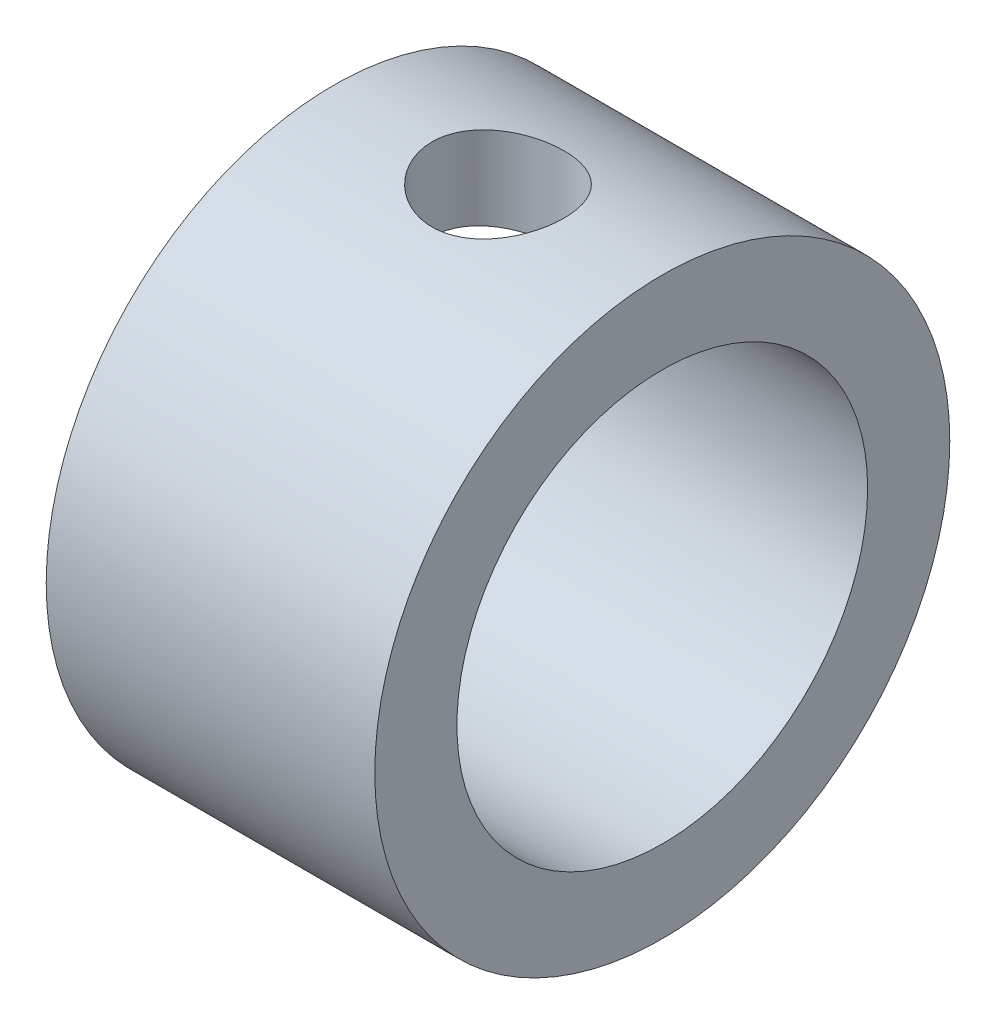
ISO-10303-21;
HEADER;
FILE_DESCRIPTION(('STEP AP214'),'2;1');
FILE_NAME('part.step','',(''),(''),'','','');
FILE_SCHEMA(('AUTOMOTIVE_DESIGN { 1 0 10303 214 1 1 1 1 }'));
ENDSEC;
DATA;
#1=APPLICATION_CONTEXT('core data for automotive mechanical design processes');
#2=APPLICATION_PROTOCOL_DEFINITION('international standard','automotive_design',2000,#1);
#3=PRODUCT_CONTEXT('',#1,'mechanical');
#4=PRODUCT('Part','Part','',(#3));
#5=PRODUCT_RELATED_PRODUCT_CATEGORY('part','',(#4));
#6=PRODUCT_DEFINITION_FORMATION('','',#4);
#7=PRODUCT_DEFINITION_CONTEXT('part definition',#1,'design');
#8=PRODUCT_DEFINITION('design','',#6,#7);
#9=PRODUCT_DEFINITION_SHAPE('','',#8);
#10=(LENGTH_UNIT() NAMED_UNIT(*) SI_UNIT(.MILLI.,.METRE.));
#11=(NAMED_UNIT(*) PLANE_ANGLE_UNIT() SI_UNIT($,.RADIAN.));
#12=(NAMED_UNIT(*) SI_UNIT($,.STERADIAN.) SOLID_ANGLE_UNIT());
#13=UNCERTAINTY_MEASURE_WITH_UNIT(LENGTH_MEASURE(1.E-05),#10,'distance_accuracy_value','');
#14=(GEOMETRIC_REPRESENTATION_CONTEXT(3) GLOBAL_UNCERTAINTY_ASSIGNED_CONTEXT((#13)) GLOBAL_UNIT_ASSIGNED_CONTEXT((#10,
#11,#12)) REPRESENTATION_CONTEXT('',''));
#15=CARTESIAN_POINT('',(0.,0.,0.));
#16=DIRECTION('',(0.,0.,1.));
#17=DIRECTION('',(1.,0.,0.));
#18=AXIS2_PLACEMENT_3D('',#15,#16,#17);
#19=CARTESIAN_POINT('',(6.35,0.,0.));
#20=DIRECTION('',(-1.,0.,0.));
#21=DIRECTION('',(0.,0.,1.));
#22=AXIS2_PLACEMENT_3D('',#19,#20,#21);
#23=CYLINDRICAL_SURFACE('',#22,11.1125);
#24=CARTESIAN_POINT('',(6.35,0.,0.));
#25=DIRECTION('',(1.,0.,0.));
#26=DIRECTION('',(0.,0.,-1.));
#27=AXIS2_PLACEMENT_3D('',#24,#25,#26);
#28=CIRCLE('',#27,11.1125);
#29=CARTESIAN_POINT('',(6.35,0.,-11.1125));
#30=VERTEX_POINT('',#29);
#31=EDGE_CURVE('E10',#30,#30,#28,.T.);
#32=ORIENTED_EDGE('',*,*,#31,.F.);
#33=EDGE_LOOP('',(#32));
#34=FACE_BOUND('',#33,.T.);
#35=CARTESIAN_POINT('',(-6.35,0.,0.));
#36=DIRECTION('',(1.,0.,0.));
#37=DIRECTION('',(0.,0.,-1.));
#38=AXIS2_PLACEMENT_3D('',#35,#36,#37);
#39=CIRCLE('',#38,11.1125);
#40=CARTESIAN_POINT('',(-6.35,0.,-11.1125));
#41=VERTEX_POINT('',#40);
#42=EDGE_CURVE('E59',#41,#41,#39,.T.);
#43=ORIENTED_EDGE('',*,*,#42,.T.);
#44=EDGE_LOOP('',(#43));
#45=FACE_BOUND('',#44,.T.);
#46=CARTESIAN_POINT('',(-2.5527,11.1125,0.));
#47=CARTESIAN_POINT('',(-2.55269543609178,11.1124974332018,0.141396983886955));
#48=CARTESIAN_POINT('',(-2.54091216211283,11.1097740216355,0.282847633119295));
#49=CARTESIAN_POINT('',(-2.494146592161,11.0991731061528,0.561718841900642));
#50=CARTESIAN_POINT('',(-2.45914887715804,11.0912921766601,0.69913665945262));
#51=CARTESIAN_POINT('',(-2.36711810464586,11.0712520995187,0.965872712295733));
#52=CARTESIAN_POINT('',(-2.31010924032117,11.0590976503434,1.09519965980491));
#53=CARTESIAN_POINT('',(-2.17575411001897,11.0318164511271,1.34245067648933));
#54=CARTESIAN_POINT('',(-2.09840795295294,11.0166897170037,1.46037480672501));
#55=CARTESIAN_POINT('',(-1.92413477586071,10.9848185181146,1.68355013345253));
#56=CARTESIAN_POINT('',(-1.82691809781612,10.968052296778,1.78857205214091));
#57=CARTESIAN_POINT('',(-1.61628478246275,10.934942063033,1.98097209612807));
#58=CARTESIAN_POINT('',(-1.50286658042958,10.9185980915853,2.06834851527531));
#59=CARTESIAN_POINT('',(-1.26132586117081,10.8879668420535,2.22401124092947));
#60=CARTESIAN_POINT('',(-1.13303951192519,10.8737073603938,2.29204929168297));
#61=CARTESIAN_POINT('',(-0.866471521299751,10.8491736694577,2.40551015870537));
#62=CARTESIAN_POINT('',(-0.728191211176467,10.8388989305457,2.45093598072595));
#63=CARTESIAN_POINT('',(-0.448059578140271,10.8237203833916,2.51711689808377));
#64=CARTESIAN_POINT('',(-0.306309588542869,10.8187278368241,2.53828011863612));
#65=CARTESIAN_POINT('',(-0.0211899516022485,10.8144127531456,2.55660488622197));
#66=CARTESIAN_POINT('',(0.122179472637741,10.8150894442946,2.5537697001011));
#67=CARTESIAN_POINT('',(0.403403115674324,10.821956227423,2.52450561772006));
#68=CARTESIAN_POINT('',(0.541310236477793,10.8280345796907,2.49855486877438));
#69=CARTESIAN_POINT('',(0.810759487185956,10.8448426730924,2.42455559340402));
#70=CARTESIAN_POINT('',(0.942301226672394,10.8555726991342,2.37650571343134));
#71=CARTESIAN_POINT('',(1.19660889805742,10.8805826828167,2.25924386489669));
#72=CARTESIAN_POINT('',(1.31928859238525,10.8948926919292,2.1898515486303));
#73=CARTESIAN_POINT('',(1.55143756353517,10.9254323400943,2.03200118441898));
#74=CARTESIAN_POINT('',(1.66090486145427,10.9416622659858,1.94354028596765));
#75=CARTESIAN_POINT('',(1.86627037617572,10.9746894913781,1.74755103037359));
#76=CARTESIAN_POINT('',(1.96178125752,10.9914910747966,1.6396170918003));
#77=CARTESIAN_POINT('',(2.13341345311464,11.023416046553,1.4090694191414));
#78=CARTESIAN_POINT('',(2.20953434232427,11.038539398099,1.28645536334506));
#79=CARTESIAN_POINT('',(2.34033690164464,11.0654612367422,1.02952843056193));
#80=CARTESIAN_POINT('',(2.39496373513032,11.0772511982725,0.895186685498861));
#81=CARTESIAN_POINT('',(2.48075726891652,11.0961150585293,0.618898468394044));
#82=CARTESIAN_POINT('',(2.51192774079699,11.1031897154151,0.47695322286274));
#83=CARTESIAN_POINT('',(2.54935090647034,11.1117164801432,0.192806062598151));
#84=CARTESIAN_POINT('',(2.55613213294177,11.113287828652,0.0506772392291482));
#85=CARTESIAN_POINT('',(2.54602262164829,11.1109669165554,-0.232682790362517));
#86=CARTESIAN_POINT('',(2.52913366434222,11.1070750668889,-0.373914063295773));
#87=CARTESIAN_POINT('',(2.47260072267747,11.0943407059216,-0.649689940724076));
#88=CARTESIAN_POINT('',(2.4332377128462,11.0855593569585,-0.784295220339056));
#89=CARTESIAN_POINT('',(2.33318895225672,11.0640306843712,-1.04499043452638));
#90=CARTESIAN_POINT('',(2.27250126147444,11.0512829999195,-1.17107959309543));
#91=CARTESIAN_POINT('',(2.1304507458463,11.0229440884721,-1.41332120124059));
#92=CARTESIAN_POINT('',(2.048782286807,11.0073118817893,-1.52928952317552));
#93=CARTESIAN_POINT('',(1.86748688971703,10.9750146582244,-1.74606464066494));
#94=CARTESIAN_POINT('',(1.76785736178379,10.9583494926232,-1.84686924584851));
#95=CARTESIAN_POINT('',(1.55103198206712,10.9254467634652,-2.03257541541658));
#96=CARTESIAN_POINT('',(1.43351831842948,10.9092249340049,-2.11710924087233));
#97=CARTESIAN_POINT('',(1.18565404716245,10.8794322006874,-2.26524689249241));
#98=CARTESIAN_POINT('',(1.05530400977803,10.86586117915,-2.32885164786836));
#99=CARTESIAN_POINT('',(0.786177613562212,10.8430441251685,-2.43287654255067));
#100=CARTESIAN_POINT('',(0.647455448603506,10.8337730723205,-2.4734311243702));
#101=CARTESIAN_POINT('',(0.364922269391302,10.8205665517312,-2.53058731275079));
#102=CARTESIAN_POINT('',(0.221112171428213,10.8166301282402,-2.54719320998149));
#103=CARTESIAN_POINT('',(-0.0637959487676096,10.8146031362269,-2.55578363505916));
#104=CARTESIAN_POINT('',(-0.204875667199246,10.8163737834957,-2.54835267393322));
#105=CARTESIAN_POINT('',(-0.483714090983084,10.8252451891123,-2.51039749828933));
#106=CARTESIAN_POINT('',(-0.621472844107363,10.8323458707403,-2.47987361616779));
#107=CARTESIAN_POINT('',(-0.889236839253046,10.8510062561454,-2.3968943427457));
#108=CARTESIAN_POINT('',(-1.01927243310839,10.8625469579085,-2.3445323331879));
#109=CARTESIAN_POINT('',(-1.26879687912242,10.8887927027367,-2.21944049580401));
#110=CARTESIAN_POINT('',(-1.38828450265125,10.9034981137437,-2.14670829936039));
#111=CARTESIAN_POINT('',(-1.61618375706103,10.9348245866065,-1.9810379612459));
#112=CARTESIAN_POINT('',(-1.72429041036667,10.9514809440837,-1.8876868833472));
#113=CARTESIAN_POINT('',(-1.92349533486788,10.9846047749399,-1.68425493001492));
#114=CARTESIAN_POINT('',(-2.01458964143335,11.0010722034529,-1.57417016570687));
#115=CARTESIAN_POINT('',(-2.17846924085506,11.0322493068355,-1.33845249094086));
#116=CARTESIAN_POINT('',(-2.25096706522613,11.0469297293786,-1.21261560861977));
#117=CARTESIAN_POINT('',(-2.37366577455705,11.0725807717166,-0.950225185766307));
#118=CARTESIAN_POINT('',(-2.4238844591734,11.0835543513714,-0.813680303281804));
#119=CARTESIAN_POINT('',(-2.49214622236147,11.0987087733419,-0.564265101296297));
#120=CARTESIAN_POINT('',(-2.51480868895532,11.1038473015745,-0.452694131517629));
#121=CARTESIAN_POINT('',(-2.5450870106318,11.1107438567368,-0.227426938195051));
#122=CARTESIAN_POINT('',(-2.55270367092034,11.1125020645708,-0.113730828710922));
#123=CARTESIAN_POINT('',(-2.5527,11.1125,0.));
#124=B_SPLINE_CURVE_WITH_KNOTS('',3,(#46,#47,#48,#49,#50,#51,#52,#53,#54,#55,#56,#57,#58,#59,
#60,#61,#62,#63,#64,#65,#66,#67,#68,#69,#70,#71,#72,#73,#74,#75,#76,#77,#78,#79,#80,#81,#82,#83,
#84,#85,#86,#87,#88,#89,#90,#91,#92,#93,#94,#95,#96,#97,#98,#99,#100,#101,#102,#103,#104,#105,
#106,#107,#108,#109,#110,#111,#112,#113,#114,#115,#116,#117,#118,#119,#120,#121,#122,#123),
.UNSPECIFIED.,.T.,.F.,(4,2,2,2,2,2,2,2,2,2,2,2,2,2,2,2,2,2,2,2,2,2,2,2,2,2,2,2,2,2,2,2,2,2,2,2,
2,2,4),(0.,0.423774493378563,0.847830739970781,1.2714222130667,1.69501141776644,
2.12528317574872,2.55559651700898,2.99120733527721,3.42676023409687,3.85487386840065,
4.28292922555791,4.70233068759837,5.12175784094858,5.54483141941707,5.96796828582672,
6.4012295003574,6.83450021142714,7.26886924458625,7.7031684200319,8.12799731890801,
8.55279426409172,8.97239311136646,9.39203014175463,9.81816596051273,10.2443632748178,
10.679284091649,11.1141855962021,11.5465237531631,11.9787844423722,12.4006134783276,
12.8224364426482,13.2424738545288,13.6625601280783,14.0919775032118,14.521494827071,
14.9572982433888,15.3927528498978,15.7336286063474,16.0744861196662),.UNSPECIFIED.);
#125=CARTESIAN_POINT('',(-2.5527,11.1125,0.));
#126=VERTEX_POINT('',#125);
#127=EDGE_CURVE('E71',#126,#126,#124,.T.);
#128=ORIENTED_EDGE('',*,*,#127,.F.);
#129=EDGE_LOOP('',(#128));
#130=FACE_BOUND('',#129,.T.);
#131=ADVANCED_FACE('F45',(#34,#45,#130),#23,.T.);
#132=CARTESIAN_POINT('',(6.35,0.,0.));
#133=DIRECTION('',(-1.,0.,0.));
#134=DIRECTION('',(0.,0.,1.));
#135=AXIS2_PLACEMENT_3D('',#132,#133,#134);
#136=CYLINDRICAL_SURFACE('',#135,7.9375);
#137=CARTESIAN_POINT('',(-6.35,0.,0.));
#138=DIRECTION('',(1.,0.,0.));
#139=DIRECTION('',(0.,0.,-1.));
#140=AXIS2_PLACEMENT_3D('',#137,#138,#139);
#141=CIRCLE('',#140,7.9375);
#142=CARTESIAN_POINT('',(-6.35,0.,-7.9375));
#143=VERTEX_POINT('',#142);
#144=EDGE_CURVE('E67',#143,#143,#141,.T.);
#145=ORIENTED_EDGE('',*,*,#144,.F.);
#146=EDGE_LOOP('',(#145));
#147=FACE_BOUND('',#146,.T.);
#148=CARTESIAN_POINT('',(6.35,0.,0.));
#149=DIRECTION('',(1.,0.,0.));
#150=DIRECTION('',(0.,0.,-1.));
#151=AXIS2_PLACEMENT_3D('',#148,#149,#150);
#152=CIRCLE('',#151,7.9375);
#153=CARTESIAN_POINT('',(6.35,0.,-7.9375));
#154=VERTEX_POINT('',#153);
#155=EDGE_CURVE('E65',#154,#154,#152,.T.);
#156=ORIENTED_EDGE('',*,*,#155,.T.);
#157=EDGE_LOOP('',(#156));
#158=FACE_BOUND('',#157,.T.);
#159=CARTESIAN_POINT('',(0.,7.51582523479624,-2.5527));
#160=CARTESIAN_POINT('',(-0.139346600684586,7.51582557632367,-2.55269971114753));
#161=CARTESIAN_POINT('',(-0.27869699952722,7.51974293711517,-2.54125136242513));
#162=CARTESIAN_POINT('',(-0.553289021729112,7.53491469994466,-2.49590144689574));
#163=CARTESIAN_POINT('',(-0.688529718161482,7.54617074452564,-2.46199485346112));
#164=CARTESIAN_POINT('',(-0.950883193784566,7.57461596048416,-2.37302681179356));
#165=CARTESIAN_POINT('',(-1.078010509473,7.59179414625879,-2.31800451206632));
#166=CARTESIAN_POINT('',(-1.32126769030459,7.63013252920181,-2.18849893119843));
#167=CARTESIAN_POINT('',(-1.43739539312875,7.65129350688081,-2.11401183441432));
#168=CARTESIAN_POINT('',(-1.65958353854979,7.69607697591265,-1.94478738917102));
#169=CARTESIAN_POINT('',(-1.76518494023195,7.71975767441604,-1.84946258910936));
#170=CARTESIAN_POINT('',(-1.95921258795073,7.76641850896737,-1.64252426841838));
#171=CARTESIAN_POINT('',(-2.04763628538701,7.78939854063389,-1.53090833502211));
#172=CARTESIAN_POINT('',(-2.20684863248756,7.83273811564113,-1.29123243811476));
#173=CARTESIAN_POINT('',(-2.27716100619694,7.85302117283388,-1.16284104461704));
#174=CARTESIAN_POINT('',(-2.39501233362205,7.8879991108473,-0.895290498759001));
#175=CARTESIAN_POINT('',(-2.44255697524526,7.90269538718606,-0.756134045861248));
#176=CARTESIAN_POINT('',(-2.51198024703793,7.92443176811295,-0.475812759716062));
#177=CARTESIAN_POINT('',(-2.53464422780791,7.93170559808778,-0.334860880829301));
#178=CARTESIAN_POINT('',(-2.55615493246242,7.93860479377837,-0.0509798569865123));
#179=CARTESIAN_POINT('',(-2.5550073809634,7.93823199784733,0.0919488044667008));
#180=CARTESIAN_POINT('',(-2.52943629368598,7.93004082009178,0.370185317384752));
#181=CARTESIAN_POINT('',(-2.50586481560465,7.92249500445732,0.505580796411313));
#182=CARTESIAN_POINT('',(-2.43751776230091,7.90114386763205,0.770380742636993));
#183=CARTESIAN_POINT('',(-2.39274077860332,7.88733813065823,0.899784811258246));
#184=CARTESIAN_POINT('',(-2.2827279989642,7.85466059751731,1.15085020327595));
#185=CARTESIAN_POINT('',(-2.21724060023923,7.83572693368372,1.27239289382776));
#186=CARTESIAN_POINT('',(-2.06787007169733,7.79477815468616,1.50302341639291));
#187=CARTESIAN_POINT('',(-1.98398208464017,7.77276222644681,1.61210794821745));
#188=CARTESIAN_POINT('',(-1.79585146804467,7.72683916797508,1.81980166153172));
#189=CARTESIAN_POINT('',(-1.69087554558153,7.70289144803447,1.91773859169293));
#190=CARTESIAN_POINT('',(-1.46577399287371,7.65663172667181,2.09482578186573));
#191=CARTESIAN_POINT('',(-1.34564635478873,7.63431994265775,2.17397354800429));
#192=CARTESIAN_POINT('',(-1.09165337170638,7.59364591537561,2.31208063987044));
#193=CARTESIAN_POINT('',(-0.957635538939519,7.57533633304698,2.37077620004262));
#194=CARTESIAN_POINT('',(-0.680884720988729,7.54535361303556,2.46454804263225));
#195=CARTESIAN_POINT('',(-0.538155111476081,7.53367792268044,2.49963341103546));
#196=CARTESIAN_POINT('',(-0.254504014560251,7.51885630848756,2.54386130196757));
#197=CARTESIAN_POINT('',(-0.113761607191343,7.51537033531058,2.55403882928714));
#198=CARTESIAN_POINT('',(0.167434668389009,7.51637595825513,2.55107903074837));
#199=CARTESIAN_POINT('',(0.307888580594817,7.52086623101547,2.53794557248091));
#200=CARTESIAN_POINT('',(0.579957850714505,7.53698124897552,2.48966382858495));
#201=CARTESIAN_POINT('',(0.711712248409019,7.54837899305516,2.4552152966626));
#202=CARTESIAN_POINT('',(0.967551252350036,7.5767802378559,2.36611058505873));
#203=CARTESIAN_POINT('',(1.09163455564805,7.59378468779607,2.31145098343907));
#204=CARTESIAN_POINT('',(1.3327328212018,7.6321162522493,2.1816068300828));
#205=CARTESIAN_POINT('',(1.44942388192024,7.65355778281115,2.10585551398745));
#206=CARTESIAN_POINT('',(1.66881407590932,7.69811716781962,1.93663149325976));
#207=CARTESIAN_POINT('',(1.77150934883917,7.72123548207621,1.8431539162752));
#208=CARTESIAN_POINT('',(1.96468756476134,7.76778209364926,1.63621078826372));
#209=CARTESIAN_POINT('',(2.05442840868062,7.79117879009399,1.52204346361738));
#210=CARTESIAN_POINT('',(2.21351548432416,7.83462873838242,1.27969958075879));
#211=CARTESIAN_POINT('',(2.28286257154473,7.85468213045889,1.15152361050373));
#212=CARTESIAN_POINT('',(2.39853808556114,7.88907942673089,0.885532654196055));
#213=CARTESIAN_POINT('',(2.445027112656,7.90346302077295,0.747792911769806));
#214=CARTESIAN_POINT('',(2.51401054606968,7.9250735620805,0.465901724515));
#215=CARTESIAN_POINT('',(2.53651295201225,7.93230289525989,0.321752434011375));
#216=CARTESIAN_POINT('',(2.55620404018551,7.93862276867031,0.0379460330004133));
#217=CARTESIAN_POINT('',(2.55446170242952,7.93805701493034,-0.101630102083227));
#218=CARTESIAN_POINT('',(2.52832011934629,7.92968343190555,-0.378409596964345));
#219=CARTESIAN_POINT('',(2.50392250248309,7.92187612314457,-0.515613126582933));
#220=CARTESIAN_POINT('',(2.43385651640187,7.90001304735228,-0.781865580300782));
#221=CARTESIAN_POINT('',(2.38848882677044,7.88604573137923,-0.911001404067889));
#222=CARTESIAN_POINT('',(2.27804477503025,7.85330151374033,-1.15988567794138));
#223=CARTESIAN_POINT('',(2.21296494366969,7.83452376554898,-1.27963247094506));
#224=CARTESIAN_POINT('',(2.06229427825578,7.79328323599368,-1.51093927736791));
#225=CARTESIAN_POINT('',(1.9760609395036,7.77071383671048,-1.62206154036841));
#226=CARTESIAN_POINT('',(1.78664678677468,7.72472049993587,-1.82861081906446));
#227=CARTESIAN_POINT('',(1.68346075731545,7.70129630119661,-1.9240329864988));
#228=CARTESIAN_POINT('',(1.45866103703046,7.65524731576655,-2.09992084227194));
#229=CARTESIAN_POINT('',(1.33652113332413,7.632680889579,-2.17973125519224));
#230=CARTESIAN_POINT('',(1.07987227668964,7.59195286462518,-2.31761819300013));
#231=CARTESIAN_POINT('',(0.945367606277684,7.57378974864802,-2.37570220772249));
#232=CARTESIAN_POINT('',(0.677198370924444,7.54517670691244,-2.46500929147571));
#233=CARTESIAN_POINT('',(0.544100171379159,7.53428580739224,-2.49779199911675));
#234=CARTESIAN_POINT('',(0.274001787540594,7.51961091874832,-2.54163439196638));
#235=CARTESIAN_POINT('',(0.137002729499932,7.51582489901346,-2.55270028399384));
#236=CARTESIAN_POINT('',(0.,7.51582523479624,-2.5527));
#237=B_SPLINE_CURVE_WITH_KNOTS('',3,(#159,#160,#161,#162,#163,#164,#165,#166,#167,#168,#169,
#170,#171,#172,#173,#174,#175,#176,#177,#178,#179,#180,#181,#182,#183,#184,#185,#186,#187,#188,
#189,#190,#191,#192,#193,#194,#195,#196,#197,#198,#199,#200,#201,#202,#203,#204,#205,#206,#207,
#208,#209,#210,#211,#212,#213,#214,#215,#216,#217,#218,#219,#220,#221,#222,#223,#224,#225,#226,
#227,#228,#229,#230,#231,#232,#233,#234,#235,#236),.UNSPECIFIED.,.T.,.F.,(4,2,2,2,2,2,2,2,2,2,2,
2,2,2,2,2,2,2,2,2,2,2,2,2,2,2,2,2,2,2,2,2,2,2,2,2,2,2,4),(0.,0.41753318231001,0.83515984892337,
1.2520159476343,1.66895382315362,2.09965907144686,2.5304281733604,2.9715771175109,
3.41261579485476,3.83929288712334,4.26586740160019,4.67685449886291,5.0878688978247,
5.50408186614504,5.92040483554259,6.35504909017835,6.789751002637,7.22986792330262,
7.66981537535615,8.09114538435516,8.512405495847,8.92052032785668,9.32870428949052,
9.74913872878057,10.1696888992885,10.6088606482804,11.0480139718579,11.4840360795886,
11.9199127268512,12.3366343221036,12.753325965679,13.1642198571305,13.5751861061924,
14.0006481462724,14.4262413253802,14.8670225994996,15.3076517808425,15.71827924849,
16.1287893388132),.UNSPECIFIED.);
#238=CARTESIAN_POINT('',(0.,7.51582523479624,-2.5527));
#239=VERTEX_POINT('',#238);
#240=EDGE_CURVE('E49',#239,#239,#237,.T.);
#241=ORIENTED_EDGE('',*,*,#240,.T.);
#242=EDGE_LOOP('',(#241));
#243=FACE_BOUND('',#242,.T.);
#244=ADVANCED_FACE('F85',(#147,#158,#243),#136,.F.);
#245=CARTESIAN_POINT('',(6.35,0.,0.));
#246=DIRECTION('',(1.,0.,0.));
#247=DIRECTION('',(0.,0.,-1.));
#248=AXIS2_PLACEMENT_3D('',#245,#246,#247);
#249=PLANE('',#248);
#250=ORIENTED_EDGE('',*,*,#31,.T.);
#251=EDGE_LOOP('',(#250));
#252=FACE_BOUND('',#251,.T.);
#253=ORIENTED_EDGE('',*,*,#155,.F.);
#254=EDGE_LOOP('',(#253));
#255=FACE_BOUND('',#254,.T.);
#256=ADVANCED_FACE('F90',(#252,#255),#249,.T.);
#257=CARTESIAN_POINT('',(-6.35,0.,0.));
#258=DIRECTION('',(1.,0.,0.));
#259=DIRECTION('',(0.,0.,-1.));
#260=AXIS2_PLACEMENT_3D('',#257,#258,#259);
#261=PLANE('',#260);
#262=ORIENTED_EDGE('',*,*,#42,.F.);
#263=EDGE_LOOP('',(#262));
#264=FACE_BOUND('',#263,.T.);
#265=ORIENTED_EDGE('',*,*,#144,.T.);
#266=EDGE_LOOP('',(#265));
#267=FACE_BOUND('',#266,.T.);
#268=ADVANCED_FACE('F83',(#264,#267),#261,.F.);
#269=CARTESIAN_POINT('',(0.,11.1125,0.));
#270=DIRECTION('',(0.,-1.,0.));
#271=DIRECTION('',(0.,0.,-1.));
#272=AXIS2_PLACEMENT_3D('',#269,#270,#271);
#273=CYLINDRICAL_SURFACE('',#272,2.5527);
#274=ORIENTED_EDGE('',*,*,#240,.F.);
#275=EDGE_LOOP('',(#274));
#276=FACE_BOUND('',#275,.T.);
#277=ORIENTED_EDGE('',*,*,#127,.T.);
#278=EDGE_LOOP('',(#277));
#279=FACE_BOUND('',#278,.T.);
#280=ADVANCED_FACE('F80',(#276,#279),#273,.F.);
#281=CLOSED_SHELL('',(#131,#244,#256,#268,#280));
#282=MANIFOLD_SOLID_BREP('B2',#281);
#283=ADVANCED_BREP_SHAPE_REPRESENTATION('',(#18,#282),#14);
#284=SHAPE_DEFINITION_REPRESENTATION(#9,#283);
ENDSEC;
END-ISO-10303-21;
